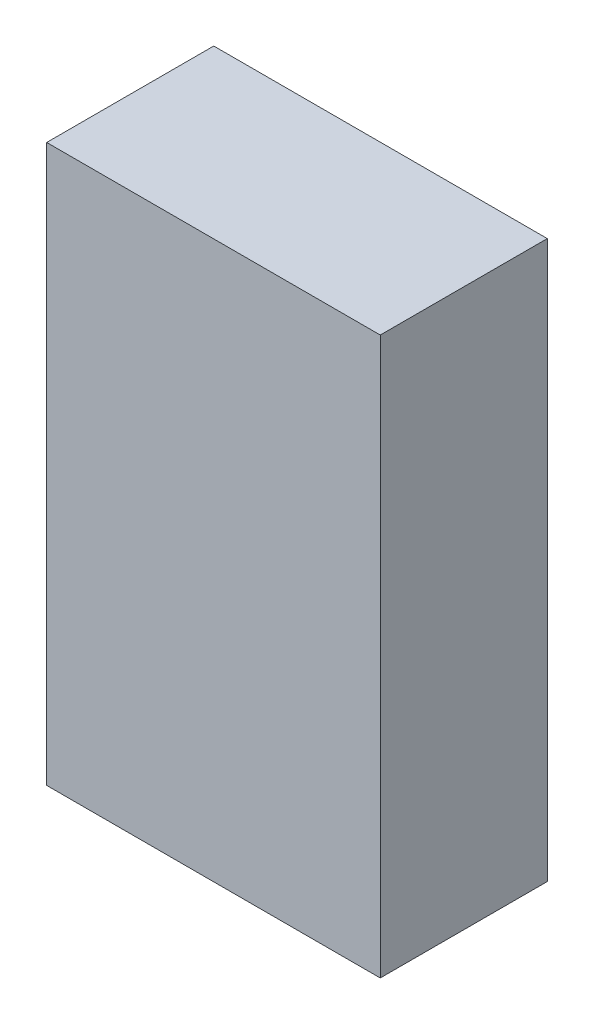
ISO-10303-21;
HEADER;
FILE_DESCRIPTION(('STEP AP214'),'2;1');
FILE_NAME('part.step','',(''),(''),'','','');
FILE_SCHEMA(('AUTOMOTIVE_DESIGN { 1 0 10303 214 1 1 1 1 }'));
ENDSEC;
DATA;
#1=APPLICATION_CONTEXT('core data for automotive mechanical design processes');
#2=APPLICATION_PROTOCOL_DEFINITION('international standard','automotive_design',2000,#1);
#3=PRODUCT_CONTEXT('',#1,'mechanical');
#4=PRODUCT('Part','Part','',(#3));
#5=PRODUCT_RELATED_PRODUCT_CATEGORY('part','',(#4));
#6=PRODUCT_DEFINITION_FORMATION('','',#4);
#7=PRODUCT_DEFINITION_CONTEXT('part definition',#1,'design');
#8=PRODUCT_DEFINITION('design','',#6,#7);
#9=PRODUCT_DEFINITION_SHAPE('','',#8);
#10=(LENGTH_UNIT() NAMED_UNIT(*) SI_UNIT(.MILLI.,.METRE.));
#11=(NAMED_UNIT(*) PLANE_ANGLE_UNIT() SI_UNIT($,.RADIAN.));
#12=(NAMED_UNIT(*) SI_UNIT($,.STERADIAN.) SOLID_ANGLE_UNIT());
#13=UNCERTAINTY_MEASURE_WITH_UNIT(LENGTH_MEASURE(1.E-05),#10,'distance_accuracy_value','');
#14=(GEOMETRIC_REPRESENTATION_CONTEXT(3) GLOBAL_UNCERTAINTY_ASSIGNED_CONTEXT((#13)) GLOBAL_UNIT_ASSIGNED_CONTEXT((#10,
#11,#12)) REPRESENTATION_CONTEXT('',''));
#15=CARTESIAN_POINT('',(0.,0.,0.));
#16=DIRECTION('',(0.,0.,1.));
#17=DIRECTION('',(1.,0.,0.));
#18=AXIS2_PLACEMENT_3D('',#15,#16,#17);
#19=CARTESIAN_POINT('',(38.03777,-63.5,38.1));
#20=DIRECTION('',(-1.,0.,0.));
#21=DIRECTION('',(0.,0.,1.));
#22=AXIS2_PLACEMENT_3D('',#19,#20,#21);
#23=PLANE('',#22);
#24=DIRECTION('',(0.,1.,0.));
#25=VECTOR('',#24,1.);
#26=CARTESIAN_POINT('',(38.03777,-63.5,0.));
#27=LINE('',#26,#25);
#28=CARTESIAN_POINT('',(38.03777,-63.5,0.));
#29=VERTEX_POINT('',#28);
#30=CARTESIAN_POINT('',(38.03777,63.5,0.));
#31=VERTEX_POINT('',#30);
#32=EDGE_CURVE('E104',#29,#31,#27,.T.);
#33=ORIENTED_EDGE('',*,*,#32,.T.);
#34=DIRECTION('',(0.,0.,-1.));
#35=VECTOR('',#34,1.);
#36=CARTESIAN_POINT('',(38.03777,63.5,38.1));
#37=LINE('',#36,#35);
#38=CARTESIAN_POINT('',(38.03777,63.5,38.1));
#39=VERTEX_POINT('',#38);
#40=EDGE_CURVE('E11',#39,#31,#37,.T.);
#41=ORIENTED_EDGE('',*,*,#40,.F.);
#42=DIRECTION('',(0.,1.,0.));
#43=VECTOR('',#42,1.);
#44=CARTESIAN_POINT('',(38.03777,-63.5,38.1));
#45=LINE('',#44,#43);
#46=CARTESIAN_POINT('',(38.03777,-63.5,38.1));
#47=VERTEX_POINT('',#46);
#48=EDGE_CURVE('E92',#47,#39,#45,.T.);
#49=ORIENTED_EDGE('',*,*,#48,.F.);
#50=DIRECTION('',(0.,0.,-1.));
#51=VECTOR('',#50,1.);
#52=CARTESIAN_POINT('',(38.03777,-63.5,38.1));
#53=LINE('',#52,#51);
#54=EDGE_CURVE('E100',#47,#29,#53,.T.);
#55=ORIENTED_EDGE('',*,*,#54,.T.);
#56=EDGE_LOOP('',(#33,#41,#49,#55));
#57=FACE_BOUND('',#56,.T.);
#58=ADVANCED_FACE('F41',(#57),#23,.F.);
#59=CARTESIAN_POINT('',(-38.03777,63.5,38.1));
#60=DIRECTION('',(0.,-1.,0.));
#61=DIRECTION('',(0.,0.,-1.));
#62=AXIS2_PLACEMENT_3D('',#59,#60,#61);
#63=PLANE('',#62);
#64=DIRECTION('',(-1.,0.,0.));
#65=VECTOR('',#64,1.);
#66=CARTESIAN_POINT('',(-38.03777,63.5,0.));
#67=LINE('',#66,#65);
#68=CARTESIAN_POINT('',(-38.03777,63.5,0.));
#69=VERTEX_POINT('',#68);
#70=EDGE_CURVE('E96',#31,#69,#67,.T.);
#71=ORIENTED_EDGE('',*,*,#70,.T.);
#72=DIRECTION('',(0.,0.,-1.));
#73=VECTOR('',#72,1.);
#74=CARTESIAN_POINT('',(-38.03777,63.5,38.1));
#75=LINE('',#74,#73);
#76=CARTESIAN_POINT('',(-38.03777,63.5,38.1));
#77=VERTEX_POINT('',#76);
#78=EDGE_CURVE('E49',#77,#69,#75,.T.);
#79=ORIENTED_EDGE('',*,*,#78,.F.);
#80=DIRECTION('',(-1.,0.,0.));
#81=VECTOR('',#80,1.);
#82=CARTESIAN_POINT('',(-38.03777,63.5,38.1));
#83=LINE('',#82,#81);
#84=EDGE_CURVE('E87',#39,#77,#83,.T.);
#85=ORIENTED_EDGE('',*,*,#84,.F.);
#86=ORIENTED_EDGE('',*,*,#40,.T.);
#87=EDGE_LOOP('',(#71,#79,#85,#86));
#88=FACE_BOUND('',#87,.T.);
#89=ADVANCED_FACE('F95',(#88),#63,.F.);
#90=CARTESIAN_POINT('',(-38.03777,-63.5,38.1));
#91=DIRECTION('',(1.,0.,0.));
#92=DIRECTION('',(0.,0.,-1.));
#93=AXIS2_PLACEMENT_3D('',#90,#91,#92);
#94=PLANE('',#93);
#95=DIRECTION('',(0.,-1.,0.));
#96=VECTOR('',#95,1.);
#97=CARTESIAN_POINT('',(-38.03777,-63.5,0.));
#98=LINE('',#97,#96);
#99=CARTESIAN_POINT('',(-38.03777,-63.5,0.));
#100=VERTEX_POINT('',#99);
#101=EDGE_CURVE('E74',#69,#100,#98,.T.);
#102=ORIENTED_EDGE('',*,*,#101,.T.);
#103=DIRECTION('',(0.,0.,-1.));
#104=VECTOR('',#103,1.);
#105=CARTESIAN_POINT('',(-38.03777,-63.5,38.1));
#106=LINE('',#105,#104);
#107=CARTESIAN_POINT('',(-38.03777,-63.5,38.1));
#108=VERTEX_POINT('',#107);
#109=EDGE_CURVE('E97',#108,#100,#106,.T.);
#110=ORIENTED_EDGE('',*,*,#109,.F.);
#111=DIRECTION('',(0.,-1.,0.));
#112=VECTOR('',#111,1.);
#113=CARTESIAN_POINT('',(-38.03777,-63.5,38.1));
#114=LINE('',#113,#112);
#115=EDGE_CURVE('E90',#77,#108,#114,.T.);
#116=ORIENTED_EDGE('',*,*,#115,.F.);
#117=ORIENTED_EDGE('',*,*,#78,.T.);
#118=EDGE_LOOP('',(#102,#110,#116,#117));
#119=FACE_BOUND('',#118,.T.);
#120=ADVANCED_FACE('F98',(#119),#94,.F.);
#121=CARTESIAN_POINT('',(-38.03777,-63.5,38.1));
#122=DIRECTION('',(0.,1.,0.));
#123=DIRECTION('',(0.,0.,1.));
#124=AXIS2_PLACEMENT_3D('',#121,#122,#123);
#125=PLANE('',#124);
#126=DIRECTION('',(1.,0.,0.));
#127=VECTOR('',#126,1.);
#128=CARTESIAN_POINT('',(-38.03777,-63.5,0.));
#129=LINE('',#128,#127);
#130=EDGE_CURVE('E80',#100,#29,#129,.T.);
#131=ORIENTED_EDGE('',*,*,#130,.T.);
#132=ORIENTED_EDGE('',*,*,#54,.F.);
#133=DIRECTION('',(1.,0.,0.));
#134=VECTOR('',#133,1.);
#135=CARTESIAN_POINT('',(-38.03777,-63.5,38.1));
#136=LINE('',#135,#134);
#137=EDGE_CURVE('E57',#108,#47,#136,.T.);
#138=ORIENTED_EDGE('',*,*,#137,.F.);
#139=ORIENTED_EDGE('',*,*,#109,.T.);
#140=EDGE_LOOP('',(#131,#132,#138,#139));
#141=FACE_BOUND('',#140,.T.);
#142=ADVANCED_FACE('F111',(#141),#125,.F.);
#143=CARTESIAN_POINT('',(0.,0.,38.1));
#144=DIRECTION('',(0.,0.,-1.));
#145=DIRECTION('',(-1.,0.,0.));
#146=AXIS2_PLACEMENT_3D('',#143,#144,#145);
#147=PLANE('',#146);
#148=ORIENTED_EDGE('',*,*,#48,.T.);
#149=ORIENTED_EDGE('',*,*,#84,.T.);
#150=ORIENTED_EDGE('',*,*,#115,.T.);
#151=ORIENTED_EDGE('',*,*,#137,.T.);
#152=EDGE_LOOP('',(#148,#149,#150,#151));
#153=FACE_BOUND('',#152,.T.);
#154=ADVANCED_FACE('F88',(#153),#147,.F.);
#155=CARTESIAN_POINT('',(0.,0.,0.));
#156=DIRECTION('',(0.,0.,-1.));
#157=DIRECTION('',(-1.,0.,0.));
#158=AXIS2_PLACEMENT_3D('',#155,#156,#157);
#159=PLANE('',#158);
#160=ORIENTED_EDGE('',*,*,#32,.F.);
#161=ORIENTED_EDGE('',*,*,#130,.F.);
#162=ORIENTED_EDGE('',*,*,#101,.F.);
#163=ORIENTED_EDGE('',*,*,#70,.F.);
#164=EDGE_LOOP('',(#160,#161,#162,#163));
#165=FACE_BOUND('',#164,.T.);
#166=ADVANCED_FACE('F114',(#165),#159,.T.);
#167=CLOSED_SHELL('',(#58,#89,#120,#142,#154,#166));
#168=MANIFOLD_SOLID_BREP('B2',#167);
#169=ADVANCED_BREP_SHAPE_REPRESENTATION('',(#18,#168),#14);
#170=SHAPE_DEFINITION_REPRESENTATION(#9,#169);
ENDSEC;
END-ISO-10303-21;
